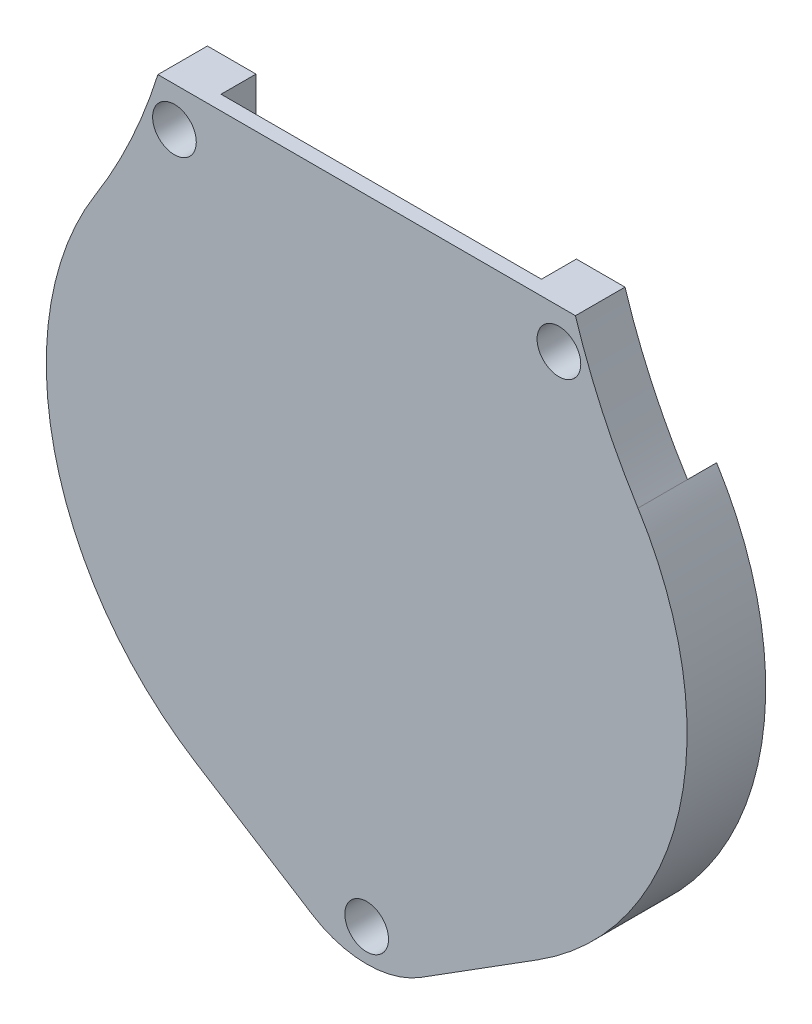
ISO-10303-21;
HEADER;
FILE_DESCRIPTION(('STEP AP214'),'2;1');
FILE_NAME('part.step','',(''),(''),'','','');
FILE_SCHEMA(('AUTOMOTIVE_DESIGN { 1 0 10303 214 1 1 1 1 }'));
ENDSEC;
DATA;
#1=APPLICATION_CONTEXT('core data for automotive mechanical design processes');
#2=APPLICATION_PROTOCOL_DEFINITION('international standard','automotive_design',2000,#1);
#3=PRODUCT_CONTEXT('',#1,'mechanical');
#4=PRODUCT('Part','Part','',(#3));
#5=PRODUCT_RELATED_PRODUCT_CATEGORY('part','',(#4));
#6=PRODUCT_DEFINITION_FORMATION('','',#4);
#7=PRODUCT_DEFINITION_CONTEXT('part definition',#1,'design');
#8=PRODUCT_DEFINITION('design','',#6,#7);
#9=PRODUCT_DEFINITION_SHAPE('','',#8);
#10=(LENGTH_UNIT() NAMED_UNIT(*) SI_UNIT(.MILLI.,.METRE.));
#11=(NAMED_UNIT(*) PLANE_ANGLE_UNIT() SI_UNIT($,.RADIAN.));
#12=(NAMED_UNIT(*) SI_UNIT($,.STERADIAN.) SOLID_ANGLE_UNIT());
#13=UNCERTAINTY_MEASURE_WITH_UNIT(LENGTH_MEASURE(1.E-05),#10,'distance_accuracy_value','');
#14=(GEOMETRIC_REPRESENTATION_CONTEXT(3) GLOBAL_UNCERTAINTY_ASSIGNED_CONTEXT((#13)) GLOBAL_UNIT_ASSIGNED_CONTEXT((#10,
#11,#12)) REPRESENTATION_CONTEXT('',''));
#15=CARTESIAN_POINT('',(0.,0.,0.));
#16=DIRECTION('',(0.,0.,1.));
#17=DIRECTION('',(1.,0.,0.));
#18=AXIS2_PLACEMENT_3D('',#15,#16,#17);
#19=CARTESIAN_POINT('',(0.,-22.5136363636364,0.));
#20=DIRECTION('',(0.,0.,-1.));
#21=DIRECTION('',(-1.,0.,0.));
#22=AXIS2_PLACEMENT_3D('',#19,#20,#21);
#23=PLANE('',#22);
#24=DIRECTION('',(-0.388341695242071,0.921515451707954,0.));
#25=VECTOR('',#24,1.);
#26=CARTESIAN_POINT('',(-23.6588709677419,14.8627529257449,0.));
#27=LINE('',#26,#25);
#28=CARTESIAN_POINT('',(-4.73782513208845,-30.035944055944,0.));
#29=VERTEX_POINT('',#28);
#30=CARTESIAN_POINT('',(-6.80534009565298,-25.1298342848197,0.));
#31=VERTEX_POINT('',#30);
#32=EDGE_CURVE('E189',#29,#31,#27,.T.);
#33=ORIENTED_EDGE('',*,*,#32,.F.);
#34=DIRECTION('',(0.846153846153846,-0.532938710021193,0.));
#35=VECTOR('',#34,1.);
#36=CARTESIAN_POINT('',(-4.73782513208844,-30.035944055944,0.));
#37=LINE('',#36,#35);
#38=CARTESIAN_POINT('',(-14.8903075579921,-23.6415384615385,0.));
#39=VERTEX_POINT('',#38);
#40=EDGE_CURVE('E340',#39,#29,#37,.T.);
#41=ORIENTED_EDGE('',*,*,#40,.F.);
#42=CARTESIAN_POINT('',(0.,0.,0.));
#43=DIRECTION('',(0.,0.,1.));
#44=DIRECTION('',(1.,0.,0.));
#45=AXIS2_PLACEMENT_3D('',#42,#43,#44);
#46=CIRCLE('',#45,27.94);
#47=CARTESIAN_POINT('',(-23.6588709677419,14.8627529257449,0.));
#48=VERTEX_POINT('',#47);
#49=EDGE_CURVE('E356',#48,#39,#46,.T.);
#50=ORIENTED_EDGE('',*,*,#49,.F.);
#51=CARTESIAN_POINT('',(-22.7387926966757,12.6794531308574,0.));
#52=VERTEX_POINT('',#51);
#53=EDGE_CURVE('E253',#52,#48,#27,.T.);
#54=ORIENTED_EDGE('',*,*,#53,.F.);
#55=CARTESIAN_POINT('',(0.,0.,0.));
#56=DIRECTION('',(0.,0.,-1.));
#57=DIRECTION('',(-1.,0.,0.));
#58=AXIS2_PLACEMENT_3D('',#55,#56,#57);
#59=CIRCLE('',#58,26.035);
#60=EDGE_CURVE('E321',#31,#52,#59,.T.);
#61=ORIENTED_EDGE('',*,*,#60,.F.);
#62=EDGE_LOOP('',(#33,#41,#50,#54,#61));
#63=FACE_BOUND('',#62,.T.);
#64=ADVANCED_FACE('F33',(#63),#23,.T.);
#65=CARTESIAN_POINT('',(11.7335904138503,23.241,6.35));
#66=DIRECTION('',(0.,1.,0.));
#67=DIRECTION('',(0.,0.,1.));
#68=AXIS2_PLACEMENT_3D('',#65,#66,#67);
#69=PLANE('',#68);
#70=DIRECTION('',(-1.,0.,0.));
#71=VECTOR('',#70,1.);
#72=CARTESIAN_POINT('',(11.7335904138503,23.241,5.588));
#73=LINE('',#72,#71);
#74=CARTESIAN_POINT('',(11.7335904138503,23.241,5.588));
#75=VERTEX_POINT('',#74);
#76=CARTESIAN_POINT('',(-11.7335904138503,23.241,5.588));
#77=VERTEX_POINT('',#76);
#78=EDGE_CURVE('E217',#75,#77,#73,.T.);
#79=ORIENTED_EDGE('',*,*,#78,.F.);
#80=DIRECTION('',(0.,0.,-1.));
#81=VECTOR('',#80,1.);
#82=CARTESIAN_POINT('',(11.7335904138503,23.241,6.35));
#83=LINE('',#82,#81);
#84=CARTESIAN_POINT('',(11.7335904138503,23.241,6.35));
#85=VERTEX_POINT('',#84);
#86=EDGE_CURVE('E331',#85,#75,#83,.T.);
#87=ORIENTED_EDGE('',*,*,#86,.F.);
#88=DIRECTION('',(1.,0.,0.));
#89=VECTOR('',#88,1.);
#90=CARTESIAN_POINT('',(11.7335904138503,23.241,6.35));
#91=LINE('',#90,#89);
#92=CARTESIAN_POINT('',(-11.7335904138503,23.241,6.35));
#93=VERTEX_POINT('',#92);
#94=EDGE_CURVE('E325',#93,#85,#91,.T.);
#95=ORIENTED_EDGE('',*,*,#94,.F.);
#96=DIRECTION('',(0.,0.,-1.));
#97=VECTOR('',#96,1.);
#98=CARTESIAN_POINT('',(-11.7335904138503,23.241,6.35));
#99=LINE('',#98,#97);
#100=EDGE_CURVE('E328',#93,#77,#99,.T.);
#101=ORIENTED_EDGE('',*,*,#100,.T.);
#102=EDGE_LOOP('',(#79,#87,#95,#101));
#103=FACE_BOUND('',#102,.T.);
#104=ADVANCED_FACE('F418',(#103),#69,.F.);
#105=CARTESIAN_POINT('',(0.,-22.5136363636364,6.858));
#106=DIRECTION('',(0.,0.,-1.));
#107=DIRECTION('',(-1.,0.,0.));
#108=AXIS2_PLACEMENT_3D('',#105,#106,#107);
#109=CYLINDRICAL_SURFACE('',#108,8.89);
#110=DIRECTION('',(0.,0.,-1.));
#111=VECTOR('',#110,1.);
#112=CARTESIAN_POINT('',(-4.73782513208844,-30.035944055944,6.858));
#113=LINE('',#112,#111);
#114=CARTESIAN_POINT('',(-4.73782513208844,-30.035944055944,6.858));
#115=VERTEX_POINT('',#114);
#116=CARTESIAN_POINT('',(-4.73782513208845,-30.035944055944,2.54));
#117=VERTEX_POINT('',#116);
#118=EDGE_CURVE('E353',#115,#117,#113,.T.);
#119=ORIENTED_EDGE('',*,*,#118,.T.);
#120=CARTESIAN_POINT('',(0.,-22.5136363636364,2.54));
#121=DIRECTION('',(0.,0.,-1.));
#122=DIRECTION('',(1.,0.,0.));
#123=AXIS2_PLACEMENT_3D('',#120,#121,#122);
#124=CIRCLE('',#123,8.89);
#125=CARTESIAN_POINT('',(4.73782513208845,-30.035944055944,2.54));
#126=VERTEX_POINT('',#125);
#127=EDGE_CURVE('E177',#126,#117,#124,.T.);
#128=ORIENTED_EDGE('',*,*,#127,.F.);
#129=DIRECTION('',(0.,0.,-1.));
#130=VECTOR('',#129,1.);
#131=CARTESIAN_POINT('',(4.73782513208844,-30.035944055944,6.858));
#132=LINE('',#131,#130);
#133=CARTESIAN_POINT('',(4.73782513208844,-30.035944055944,6.858));
#134=VERTEX_POINT('',#133);
#135=EDGE_CURVE('E209',#134,#126,#132,.T.);
#136=ORIENTED_EDGE('',*,*,#135,.F.);
#137=CARTESIAN_POINT('',(0.,-22.5136363636364,6.858));
#138=DIRECTION('',(0.,0.,1.));
#139=DIRECTION('',(-1.,0.,0.));
#140=AXIS2_PLACEMENT_3D('',#137,#138,#139);
#141=CIRCLE('',#140,8.89);
#142=EDGE_CURVE('E336',#115,#134,#141,.T.);
#143=ORIENTED_EDGE('',*,*,#142,.F.);
#144=EDGE_LOOP('',(#119,#128,#136,#143));
#145=FACE_BOUND('',#144,.T.);
#146=ADVANCED_FACE('F35',(#145),#109,.T.);
#147=CARTESIAN_POINT('',(4.73782513208844,-30.035944055944,6.858));
#148=DIRECTION('',(-0.532938710021193,0.846153846153846,0.));
#149=DIRECTION('',(-0.846153846153846,-0.532938710021193,0.));
#150=AXIS2_PLACEMENT_3D('',#147,#148,#149);
#151=PLANE('',#150);
#152=DIRECTION('',(0.846153846153846,0.532938710021193,0.));
#153=VECTOR('',#152,1.);
#154=CARTESIAN_POINT('',(4.73782513208844,-30.035944055944,0.));
#155=LINE('',#154,#153);
#156=CARTESIAN_POINT('',(4.73782513208845,-30.035944055944,0.));
#157=VERTEX_POINT('',#156);
#158=CARTESIAN_POINT('',(14.8903075579921,-23.6415384615385,0.));
#159=VERTEX_POINT('',#158);
#160=EDGE_CURVE('E250',#157,#159,#155,.T.);
#161=ORIENTED_EDGE('',*,*,#160,.T.);
#162=DIRECTION('',(0.,0.,-1.));
#163=VECTOR('',#162,1.);
#164=CARTESIAN_POINT('',(14.8903075579921,-23.6415384615385,6.858));
#165=LINE('',#164,#163);
#166=CARTESIAN_POINT('',(14.8903075579921,-23.6415384615385,6.858));
#167=VERTEX_POINT('',#166);
#168=EDGE_CURVE('E206',#167,#159,#165,.T.);
#169=ORIENTED_EDGE('',*,*,#168,.F.);
#170=DIRECTION('',(0.846153846153846,0.532938710021193,0.));
#171=VECTOR('',#170,1.);
#172=CARTESIAN_POINT('',(4.73782513208844,-30.035944055944,6.858));
#173=LINE('',#172,#171);
#174=EDGE_CURVE('E339',#134,#167,#173,.T.);
#175=ORIENTED_EDGE('',*,*,#174,.F.);
#176=ORIENTED_EDGE('',*,*,#135,.T.);
#177=DIRECTION('',(0.,0.,-1.));
#178=VECTOR('',#177,1.);
#179=CARTESIAN_POINT('',(4.73782513208845,-30.035944055944,2.54));
#180=LINE('',#179,#178);
#181=EDGE_CURVE('E201',#126,#157,#180,.T.);
#182=ORIENTED_EDGE('',*,*,#181,.T.);
#183=EDGE_LOOP('',(#161,#169,#175,#176,#182));
#184=FACE_BOUND('',#183,.T.);
#185=ADVANCED_FACE('F632',(#184),#151,.F.);
#186=CARTESIAN_POINT('',(0.,0.,6.858));
#187=DIRECTION('',(0.,0.,-1.));
#188=DIRECTION('',(-1.,0.,0.));
#189=AXIS2_PLACEMENT_3D('',#186,#187,#188);
#190=CYLINDRICAL_SURFACE('',#189,27.94);
#191=CARTESIAN_POINT('',(0.,0.,0.));
#192=DIRECTION('',(0.,0.,1.));
#193=DIRECTION('',(-1.,0.,0.));
#194=AXIS2_PLACEMENT_3D('',#191,#192,#193);
#195=CIRCLE('',#194,27.94);
#196=CARTESIAN_POINT('',(23.6588709677419,14.8627529257449,0.));
#197=VERTEX_POINT('',#196);
#198=EDGE_CURVE('E200',#159,#197,#195,.T.);
#199=ORIENTED_EDGE('',*,*,#198,.T.);
#200=DIRECTION('',(0.,0.,-1.));
#201=VECTOR('',#200,1.);
#202=CARTESIAN_POINT('',(23.6588709677419,14.8627529257449,2.54));
#203=LINE('',#202,#201);
#204=CARTESIAN_POINT('',(23.6588709677419,14.8627529257449,2.54));
#205=VERTEX_POINT('',#204);
#206=EDGE_CURVE('E173',#205,#197,#203,.T.);
#207=ORIENTED_EDGE('',*,*,#206,.F.);
#208=DIRECTION('',(0.,0.,-1.));
#209=VECTOR('',#208,1.);
#210=CARTESIAN_POINT('',(23.6588709677419,14.8627529257449,6.858));
#211=LINE('',#210,#209);
#212=CARTESIAN_POINT('',(23.6588709677419,14.8627529257449,6.858));
#213=VERTEX_POINT('',#212);
#214=EDGE_CURVE('E196',#213,#205,#211,.T.);
#215=ORIENTED_EDGE('',*,*,#214,.F.);
#216=CARTESIAN_POINT('',(0.,0.,6.858));
#217=DIRECTION('',(0.,0.,1.));
#218=DIRECTION('',(-1.,0.,0.));
#219=AXIS2_PLACEMENT_3D('',#216,#217,#218);
#220=CIRCLE('',#219,27.94);
#221=EDGE_CURVE('E342',#167,#213,#220,.T.);
#222=ORIENTED_EDGE('',*,*,#221,.F.);
#223=ORIENTED_EDGE('',*,*,#168,.T.);
#224=EDGE_LOOP('',(#199,#207,#215,#222,#223));
#225=FACE_BOUND('',#224,.T.);
#226=ADVANCED_FACE('F194',(#225),#190,.T.);
#227=CARTESIAN_POINT('',(66.675,41.8859400634629,6.858));
#228=DIRECTION('',(0.,0.,-1.));
#229=DIRECTION('',(-1.,0.,0.));
#230=AXIS2_PLACEMENT_3D('',#227,#228,#229);
#231=CYLINDRICAL_SURFACE('',#230,50.8);
#232=ORIENTED_EDGE('',*,*,#214,.T.);
#233=CARTESIAN_POINT('',(66.675,41.8859400634628,2.54));
#234=DIRECTION('',(0.,0.,1.));
#235=DIRECTION('',(1.,0.,0.));
#236=AXIS2_PLACEMENT_3D('',#233,#234,#235);
#237=CIRCLE('',#236,50.8);
#238=CARTESIAN_POINT('',(18.2073286304664,26.67,2.54));
#239=VERTEX_POINT('',#238);
#240=EDGE_CURVE('E181',#239,#205,#237,.T.);
#241=ORIENTED_EDGE('',*,*,#240,.F.);
#242=DIRECTION('',(0.,0.,-1.));
#243=VECTOR('',#242,1.);
#244=CARTESIAN_POINT('',(18.2073286304664,26.67,6.858));
#245=LINE('',#244,#243);
#246=CARTESIAN_POINT('',(18.2073286304664,26.67,6.858));
#247=VERTEX_POINT('',#246);
#248=EDGE_CURVE('E207',#247,#239,#245,.T.);
#249=ORIENTED_EDGE('',*,*,#248,.F.);
#250=CARTESIAN_POINT('',(66.675,41.8859400634629,6.858));
#251=DIRECTION('',(0.,0.,-1.));
#252=DIRECTION('',(1.,0.,0.));
#253=AXIS2_PLACEMENT_3D('',#250,#251,#252);
#254=CIRCLE('',#253,50.8);
#255=EDGE_CURVE('E205',#213,#247,#254,.T.);
#256=ORIENTED_EDGE('',*,*,#255,.F.);
#257=EDGE_LOOP('',(#232,#241,#249,#256));
#258=FACE_BOUND('',#257,.T.);
#259=ADVANCED_FACE('F204',(#258),#231,.F.);
#260=CARTESIAN_POINT('',(-18.2073286304664,26.67,6.858));
#261=DIRECTION('',(0.,-1.,0.));
#262=DIRECTION('',(0.,0.,-1.));
#263=AXIS2_PLACEMENT_3D('',#260,#261,#262);
#264=PLANE('',#263);
#265=ORIENTED_EDGE('',*,*,#248,.T.);
#266=DIRECTION('',(1.,0.,0.));
#267=VECTOR('',#266,1.);
#268=CARTESIAN_POINT('',(18.2073286304664,26.67,2.54));
#269=LINE('',#268,#267);
#270=CARTESIAN_POINT('',(13.97,26.67,2.54));
#271=VERTEX_POINT('',#270);
#272=EDGE_CURVE('E184',#271,#239,#269,.T.);
#273=ORIENTED_EDGE('',*,*,#272,.F.);
#274=DIRECTION('',(0.,0.,1.));
#275=VECTOR('',#274,1.);
#276=CARTESIAN_POINT('',(13.97,26.67,6.858));
#277=LINE('',#276,#275);
#278=CARTESIAN_POINT('',(13.97,26.67,5.588));
#279=VERTEX_POINT('',#278);
#280=EDGE_CURVE('E319',#271,#279,#277,.T.);
#281=ORIENTED_EDGE('',*,*,#280,.T.);
#282=DIRECTION('',(1.,0.,0.));
#283=VECTOR('',#282,1.);
#284=CARTESIAN_POINT('',(-18.2073286304664,26.67,5.588));
#285=LINE('',#284,#283);
#286=CARTESIAN_POINT('',(-13.97,26.67,5.588));
#287=VERTEX_POINT('',#286);
#288=EDGE_CURVE('E313',#287,#279,#285,.T.);
#289=ORIENTED_EDGE('',*,*,#288,.F.);
#290=DIRECTION('',(0.,0.,-1.));
#291=VECTOR('',#290,1.);
#292=CARTESIAN_POINT('',(-13.97,26.67,6.858));
#293=LINE('',#292,#291);
#294=CARTESIAN_POINT('',(-13.97,26.67,2.54));
#295=VERTEX_POINT('',#294);
#296=EDGE_CURVE('E316',#287,#295,#293,.T.);
#297=ORIENTED_EDGE('',*,*,#296,.T.);
#298=CARTESIAN_POINT('',(-18.2073286304664,26.67,2.54));
#299=VERTEX_POINT('',#298);
#300=EDGE_CURVE('E202',#299,#295,#269,.T.);
#301=ORIENTED_EDGE('',*,*,#300,.F.);
#302=DIRECTION('',(0.,0.,-1.));
#303=VECTOR('',#302,1.);
#304=CARTESIAN_POINT('',(-18.2073286304664,26.67,6.858));
#305=LINE('',#304,#303);
#306=CARTESIAN_POINT('',(-18.2073286304664,26.67,6.858));
#307=VERTEX_POINT('',#306);
#308=EDGE_CURVE('E211',#307,#299,#305,.T.);
#309=ORIENTED_EDGE('',*,*,#308,.F.);
#310=DIRECTION('',(-1.,0.,0.));
#311=VECTOR('',#310,1.);
#312=CARTESIAN_POINT('',(-18.2073286304664,26.67,6.858));
#313=LINE('',#312,#311);
#314=EDGE_CURVE('E345',#247,#307,#313,.T.);
#315=ORIENTED_EDGE('',*,*,#314,.F.);
#316=EDGE_LOOP('',(#265,#273,#281,#289,#297,#301,#309,#315));
#317=FACE_BOUND('',#316,.T.);
#318=ADVANCED_FACE('F378',(#317),#264,.F.);
#319=CARTESIAN_POINT('',(-66.675,41.8859400634629,6.858));
#320=DIRECTION('',(0.,0.,-1.));
#321=DIRECTION('',(-1.,0.,0.));
#322=AXIS2_PLACEMENT_3D('',#319,#320,#321);
#323=CYLINDRICAL_SURFACE('',#322,50.8);
#324=ORIENTED_EDGE('',*,*,#308,.T.);
#325=CARTESIAN_POINT('',(-66.675,41.8859400634628,2.54));
#326=DIRECTION('',(0.,0.,1.));
#327=DIRECTION('',(-1.,0.,0.));
#328=AXIS2_PLACEMENT_3D('',#325,#326,#327);
#329=CIRCLE('',#328,50.8);
#330=CARTESIAN_POINT('',(-23.6588709677419,14.8627529257449,2.54));
#331=VERTEX_POINT('',#330);
#332=EDGE_CURVE('E374',#331,#299,#329,.T.);
#333=ORIENTED_EDGE('',*,*,#332,.F.);
#334=DIRECTION('',(0.,0.,-1.));
#335=VECTOR('',#334,1.);
#336=CARTESIAN_POINT('',(-23.6588709677419,14.8627529257449,6.858));
#337=LINE('',#336,#335);
#338=CARTESIAN_POINT('',(-23.6588709677419,14.8627529257449,6.858));
#339=VERTEX_POINT('',#338);
#340=EDGE_CURVE('E365',#339,#331,#337,.T.);
#341=ORIENTED_EDGE('',*,*,#340,.F.);
#342=CARTESIAN_POINT('',(-66.675,41.8859400634629,6.858));
#343=DIRECTION('',(0.,0.,-1.));
#344=DIRECTION('',(-1.,0.,0.));
#345=AXIS2_PLACEMENT_3D('',#342,#343,#344);
#346=CIRCLE('',#345,50.8);
#347=EDGE_CURVE('E347',#307,#339,#346,.T.);
#348=ORIENTED_EDGE('',*,*,#347,.F.);
#349=EDGE_LOOP('',(#324,#333,#341,#348));
#350=FACE_BOUND('',#349,.T.);
#351=ADVANCED_FACE('F372',(#350),#323,.F.);
#352=CARTESIAN_POINT('',(0.,0.,6.858));
#353=DIRECTION('',(0.,0.,-1.));
#354=DIRECTION('',(-1.,0.,0.));
#355=AXIS2_PLACEMENT_3D('',#352,#353,#354);
#356=CYLINDRICAL_SURFACE('',#355,27.94);
#357=ORIENTED_EDGE('',*,*,#49,.T.);
#358=DIRECTION('',(0.,0.,-1.));
#359=VECTOR('',#358,1.);
#360=CARTESIAN_POINT('',(-14.8903075579921,-23.6415384615385,6.858));
#361=LINE('',#360,#359);
#362=CARTESIAN_POINT('',(-14.8903075579921,-23.6415384615385,6.858));
#363=VERTEX_POINT('',#362);
#364=EDGE_CURVE('E362',#363,#39,#361,.T.);
#365=ORIENTED_EDGE('',*,*,#364,.F.);
#366=CARTESIAN_POINT('',(0.,0.,6.858));
#367=DIRECTION('',(0.,0.,1.));
#368=DIRECTION('',(1.,0.,0.));
#369=AXIS2_PLACEMENT_3D('',#366,#367,#368);
#370=CIRCLE('',#369,27.94);
#371=EDGE_CURVE('E349',#339,#363,#370,.T.);
#372=ORIENTED_EDGE('',*,*,#371,.F.);
#373=ORIENTED_EDGE('',*,*,#340,.T.);
#374=DIRECTION('',(0.,0.,-1.));
#375=VECTOR('',#374,1.);
#376=CARTESIAN_POINT('',(-23.6588709677419,14.8627529257449,2.54));
#377=LINE('',#376,#375);
#378=EDGE_CURVE('E228',#331,#48,#377,.T.);
#379=ORIENTED_EDGE('',*,*,#378,.T.);
#380=EDGE_LOOP('',(#357,#365,#372,#373,#379));
#381=FACE_BOUND('',#380,.T.);
#382=ADVANCED_FACE('F394',(#381),#356,.T.);
#383=CARTESIAN_POINT('',(-4.73782513208844,-30.035944055944,6.858));
#384=DIRECTION('',(0.532938710021193,0.846153846153846,0.));
#385=DIRECTION('',(-0.846153846153846,0.532938710021193,0.));
#386=AXIS2_PLACEMENT_3D('',#383,#384,#385);
#387=PLANE('',#386);
#388=ORIENTED_EDGE('',*,*,#40,.T.);
#389=DIRECTION('',(0.,0.,-1.));
#390=VECTOR('',#389,1.);
#391=CARTESIAN_POINT('',(-4.73782513208845,-30.035944055944,2.54));
#392=LINE('',#391,#390);
#393=EDGE_CURVE('E260',#117,#29,#392,.T.);
#394=ORIENTED_EDGE('',*,*,#393,.F.);
#395=ORIENTED_EDGE('',*,*,#118,.F.);
#396=DIRECTION('',(0.846153846153846,-0.532938710021193,0.));
#397=VECTOR('',#396,1.);
#398=CARTESIAN_POINT('',(-4.73782513208844,-30.035944055944,6.858));
#399=LINE('',#398,#397);
#400=EDGE_CURVE('E351',#363,#115,#399,.T.);
#401=ORIENTED_EDGE('',*,*,#400,.F.);
#402=ORIENTED_EDGE('',*,*,#364,.T.);
#403=EDGE_LOOP('',(#388,#394,#395,#401,#402));
#404=FACE_BOUND('',#403,.T.);
#405=ADVANCED_FACE('F402',(#404),#387,.F.);
#406=CARTESIAN_POINT('',(0.,-22.5136363636364,6.858));
#407=DIRECTION('',(0.,0.,-1.));
#408=DIRECTION('',(-1.,0.,0.));
#409=AXIS2_PLACEMENT_3D('',#406,#407,#408);
#410=PLANE('',#409);
#411=CARTESIAN_POINT('',(0.,-28.575,6.858));
#412=DIRECTION('',(0.,0.,1.));
#413=DIRECTION('',(1.,0.,0.));
#414=AXIS2_PLACEMENT_3D('',#411,#412,#413);
#415=CIRCLE('',#414,1.905);
#416=CARTESIAN_POINT('',(1.905,-28.575,6.858));
#417=VERTEX_POINT('',#416);
#418=EDGE_CURVE('E290',#417,#417,#415,.T.);
#419=ORIENTED_EDGE('',*,*,#418,.F.);
#420=EDGE_LOOP('',(#419));
#421=FACE_BOUND('',#420,.T.);
#422=CARTESIAN_POINT('',(-16.764,23.241,6.858));
#423=DIRECTION('',(0.,0.,1.));
#424=DIRECTION('',(1.,0.,0.));
#425=AXIS2_PLACEMENT_3D('',#422,#423,#424);
#426=CIRCLE('',#425,1.905);
#427=CARTESIAN_POINT('',(-14.859,23.241,6.858));
#428=VERTEX_POINT('',#427);
#429=EDGE_CURVE('E296',#428,#428,#426,.T.);
#430=ORIENTED_EDGE('',*,*,#429,.F.);
#431=EDGE_LOOP('',(#430));
#432=FACE_BOUND('',#431,.T.);
#433=CARTESIAN_POINT('',(16.764,23.241,6.858));
#434=DIRECTION('',(0.,0.,1.));
#435=DIRECTION('',(1.,0.,0.));
#436=AXIS2_PLACEMENT_3D('',#433,#434,#435);
#437=CIRCLE('',#436,1.905);
#438=CARTESIAN_POINT('',(18.669,23.241,6.858));
#439=VERTEX_POINT('',#438);
#440=EDGE_CURVE('E279',#439,#439,#437,.T.);
#441=ORIENTED_EDGE('',*,*,#440,.F.);
#442=EDGE_LOOP('',(#441));
#443=FACE_BOUND('',#442,.T.);
#444=ORIENTED_EDGE('',*,*,#142,.T.);
#445=ORIENTED_EDGE('',*,*,#174,.T.);
#446=ORIENTED_EDGE('',*,*,#221,.T.);
#447=ORIENTED_EDGE('',*,*,#255,.T.);
#448=ORIENTED_EDGE('',*,*,#314,.T.);
#449=ORIENTED_EDGE('',*,*,#347,.T.);
#450=ORIENTED_EDGE('',*,*,#371,.T.);
#451=ORIENTED_EDGE('',*,*,#400,.T.);
#452=EDGE_LOOP('',(#444,#445,#446,#447,#448,#449,#450,#451));
#453=FACE_BOUND('',#452,.T.);
#454=ADVANCED_FACE('F406',(#421,#432,#443,#453),#410,.F.);
#455=DIRECTION('',(-0.388341695242071,-0.921515451707954,0.));
#456=VECTOR('',#455,1.);
#457=CARTESIAN_POINT('',(23.6588709677419,14.8627529257449,0.));
#458=LINE('',#457,#456);
#459=CARTESIAN_POINT('',(22.7387926966757,12.6794531308574,0.));
#460=VERTEX_POINT('',#459);
#461=EDGE_CURVE('E251',#197,#460,#458,.T.);
#462=ORIENTED_EDGE('',*,*,#461,.F.);
#463=ORIENTED_EDGE('',*,*,#198,.F.);
#464=ORIENTED_EDGE('',*,*,#160,.F.);
#465=CARTESIAN_POINT('',(6.80534009565298,-25.1298342848197,0.));
#466=VERTEX_POINT('',#465);
#467=EDGE_CURVE('E245',#466,#157,#458,.T.);
#468=ORIENTED_EDGE('',*,*,#467,.F.);
#469=EDGE_CURVE('E239',#460,#466,#59,.T.);
#470=ORIENTED_EDGE('',*,*,#469,.F.);
#471=EDGE_LOOP('',(#462,#463,#464,#468,#470));
#472=FACE_BOUND('',#471,.T.);
#473=ADVANCED_FACE('F249',(#472),#23,.T.);
#474=CARTESIAN_POINT('',(0.,0.,6.35));
#475=DIRECTION('',(0.,0.,-1.));
#476=DIRECTION('',(-1.,0.,0.));
#477=AXIS2_PLACEMENT_3D('',#474,#475,#476);
#478=CYLINDRICAL_SURFACE('',#477,26.035);
#479=CARTESIAN_POINT('',(0.,0.,2.54));
#480=DIRECTION('',(0.,0.,1.));
#481=DIRECTION('',(1.,0.,0.));
#482=AXIS2_PLACEMENT_3D('',#479,#480,#481);
#483=CIRCLE('',#482,26.035);
#484=CARTESIAN_POINT('',(6.80534009565298,-25.1298342848197,2.54));
#485=VERTEX_POINT('',#484);
#486=CARTESIAN_POINT('',(-6.80534009565298,-25.1298342848197,2.54));
#487=VERTEX_POINT('',#486);
#488=EDGE_CURVE('E237',#485,#487,#483,.F.);
#489=ORIENTED_EDGE('',*,*,#488,.T.);
#490=DIRECTION('',(0.,0.,-1.));
#491=VECTOR('',#490,1.);
#492=CARTESIAN_POINT('',(-6.80534009565298,-25.1298342848197,6.35));
#493=LINE('',#492,#491);
#494=EDGE_CURVE('E11',#487,#31,#493,.T.);
#495=ORIENTED_EDGE('',*,*,#494,.T.);
#496=ORIENTED_EDGE('',*,*,#60,.T.);
#497=DIRECTION('',(0.,0.,-1.));
#498=VECTOR('',#497,1.);
#499=CARTESIAN_POINT('',(-22.7387926966757,12.6794531308574,6.35));
#500=LINE('',#499,#498);
#501=CARTESIAN_POINT('',(-22.7387926966757,12.6794531308574,2.54));
#502=VERTEX_POINT('',#501);
#503=EDGE_CURVE('E230',#52,#502,#500,.F.);
#504=ORIENTED_EDGE('',*,*,#503,.T.);
#505=CARTESIAN_POINT('',(-13.97,21.9695317428479,2.54));
#506=VERTEX_POINT('',#505);
#507=EDGE_CURVE('E271',#502,#506,#483,.F.);
#508=ORIENTED_EDGE('',*,*,#507,.T.);
#509=DIRECTION('',(0.,0.,-1.));
#510=VECTOR('',#509,1.);
#511=CARTESIAN_POINT('',(-13.97,21.9695317428479,6.35));
#512=LINE('',#511,#510);
#513=CARTESIAN_POINT('',(-13.97,21.9695317428479,5.588));
#514=VERTEX_POINT('',#513);
#515=EDGE_CURVE('E219',#506,#514,#512,.F.);
#516=ORIENTED_EDGE('',*,*,#515,.T.);
#517=CARTESIAN_POINT('',(0.,0.,5.588));
#518=DIRECTION('',(0.,0.,-1.));
#519=DIRECTION('',(-1.,0.,0.));
#520=AXIS2_PLACEMENT_3D('',#517,#518,#519);
#521=CIRCLE('',#520,26.035);
#522=EDGE_CURVE('E309',#77,#514,#521,.F.);
#523=ORIENTED_EDGE('',*,*,#522,.F.);
#524=ORIENTED_EDGE('',*,*,#100,.F.);
#525=CARTESIAN_POINT('',(0.,0.,6.35));
#526=DIRECTION('',(0.,0.,-1.));
#527=DIRECTION('',(-1.,0.,0.));
#528=AXIS2_PLACEMENT_3D('',#525,#526,#527);
#529=CIRCLE('',#528,26.035);
#530=EDGE_CURVE('E322',#85,#93,#529,.T.);
#531=ORIENTED_EDGE('',*,*,#530,.F.);
#532=ORIENTED_EDGE('',*,*,#86,.T.);
#533=CARTESIAN_POINT('',(13.97,21.9695317428479,5.588));
#534=VERTEX_POINT('',#533);
#535=EDGE_CURVE('E312',#534,#75,#521,.F.);
#536=ORIENTED_EDGE('',*,*,#535,.F.);
#537=DIRECTION('',(0.,0.,-1.));
#538=VECTOR('',#537,1.);
#539=CARTESIAN_POINT('',(13.97,21.9695317428479,6.35));
#540=LINE('',#539,#538);
#541=CARTESIAN_POINT('',(13.97,21.9695317428479,2.54));
#542=VERTEX_POINT('',#541);
#543=EDGE_CURVE('E221',#534,#542,#540,.T.);
#544=ORIENTED_EDGE('',*,*,#543,.T.);
#545=CARTESIAN_POINT('',(22.7387926966757,12.6794531308574,2.54));
#546=VERTEX_POINT('',#545);
#547=EDGE_CURVE('E56',#542,#546,#483,.F.);
#548=ORIENTED_EDGE('',*,*,#547,.T.);
#549=DIRECTION('',(0.,0.,-1.));
#550=VECTOR('',#549,1.);
#551=CARTESIAN_POINT('',(22.7387926966757,12.6794531308574,6.35));
#552=LINE('',#551,#550);
#553=EDGE_CURVE('E176',#546,#460,#552,.T.);
#554=ORIENTED_EDGE('',*,*,#553,.T.);
#555=ORIENTED_EDGE('',*,*,#469,.T.);
#556=DIRECTION('',(0.,0.,-1.));
#557=VECTOR('',#556,1.);
#558=CARTESIAN_POINT('',(6.80534009565298,-25.1298342848197,6.35));
#559=LINE('',#558,#557);
#560=EDGE_CURVE('E41',#466,#485,#559,.F.);
#561=ORIENTED_EDGE('',*,*,#560,.T.);
#562=EDGE_LOOP('',(#489,#495,#496,#504,#508,#516,#523,#524,#531,#532,#536,#544,#548,#554,#555,#561));
#563=FACE_BOUND('',#562,.T.);
#564=ADVANCED_FACE('F236',(#563),#478,.F.);
#565=CARTESIAN_POINT('',(0.,0.,6.35));
#566=DIRECTION('',(0.,0.,-1.));
#567=DIRECTION('',(-1.,0.,0.));
#568=AXIS2_PLACEMENT_3D('',#565,#566,#567);
#569=PLANE('',#568);
#570=ORIENTED_EDGE('',*,*,#530,.T.);
#571=ORIENTED_EDGE('',*,*,#94,.T.);
#572=EDGE_LOOP('',(#570,#571));
#573=FACE_BOUND('',#572,.T.);
#574=ADVANCED_FACE('F432',(#573),#569,.T.);
#575=CARTESIAN_POINT('',(13.97,37.2037492414519,5.588));
#576=DIRECTION('',(1.,0.,0.));
#577=DIRECTION('',(0.,1.,0.));
#578=AXIS2_PLACEMENT_3D('',#575,#576,#577);
#579=PLANE('',#578);
#580=ORIENTED_EDGE('',*,*,#280,.F.);
#581=DIRECTION('',(0.,-1.,0.));
#582=VECTOR('',#581,1.);
#583=CARTESIAN_POINT('',(13.97,37.2037492414519,2.54));
#584=LINE('',#583,#582);
#585=EDGE_CURVE('E274',#271,#542,#584,.T.);
#586=ORIENTED_EDGE('',*,*,#585,.T.);
#587=ORIENTED_EDGE('',*,*,#543,.F.);
#588=DIRECTION('',(0.,-1.,0.));
#589=VECTOR('',#588,1.);
#590=CARTESIAN_POINT('',(13.97,37.2037492414519,5.588));
#591=LINE('',#590,#589);
#592=EDGE_CURVE('E289',#279,#534,#591,.T.);
#593=ORIENTED_EDGE('',*,*,#592,.F.);
#594=EDGE_LOOP('',(#580,#586,#587,#593));
#595=FACE_BOUND('',#594,.T.);
#596=ADVANCED_FACE('F410',(#595),#579,.F.);
#597=CARTESIAN_POINT('',(-13.97,37.2037492414519,5.588));
#598=DIRECTION('',(-1.,0.,0.));
#599=DIRECTION('',(0.,-1.,0.));
#600=AXIS2_PLACEMENT_3D('',#597,#598,#599);
#601=PLANE('',#600);
#602=ORIENTED_EDGE('',*,*,#515,.F.);
#603=DIRECTION('',(0.,1.,0.));
#604=VECTOR('',#603,1.);
#605=CARTESIAN_POINT('',(-13.97,37.2037492414519,2.54));
#606=LINE('',#605,#604);
#607=EDGE_CURVE('E268',#506,#295,#606,.T.);
#608=ORIENTED_EDGE('',*,*,#607,.T.);
#609=ORIENTED_EDGE('',*,*,#296,.F.);
#610=DIRECTION('',(0.,1.,0.));
#611=VECTOR('',#610,1.);
#612=CARTESIAN_POINT('',(-13.97,37.2037492414519,5.588));
#613=LINE('',#612,#611);
#614=EDGE_CURVE('E306',#514,#287,#613,.T.);
#615=ORIENTED_EDGE('',*,*,#614,.F.);
#616=EDGE_LOOP('',(#602,#608,#609,#615));
#617=FACE_BOUND('',#616,.T.);
#618=ADVANCED_FACE('F423',(#617),#601,.F.);
#619=CARTESIAN_POINT('',(0.,0.,5.588));
#620=DIRECTION('',(0.,0.,-1.));
#621=DIRECTION('',(-1.,0.,0.));
#622=AXIS2_PLACEMENT_3D('',#619,#620,#621);
#623=PLANE('',#622);
#624=ORIENTED_EDGE('',*,*,#288,.T.);
#625=ORIENTED_EDGE('',*,*,#592,.T.);
#626=ORIENTED_EDGE('',*,*,#535,.T.);
#627=ORIENTED_EDGE('',*,*,#78,.T.);
#628=ORIENTED_EDGE('',*,*,#522,.T.);
#629=ORIENTED_EDGE('',*,*,#614,.T.);
#630=EDGE_LOOP('',(#624,#625,#626,#627,#628,#629));
#631=FACE_BOUND('',#630,.T.);
#632=ADVANCED_FACE('F413',(#631),#623,.T.);
#633=CARTESIAN_POINT('',(16.764,23.241,3.683));
#634=DIRECTION('',(0.,0.,1.));
#635=DIRECTION('',(1.,0.,0.));
#636=AXIS2_PLACEMENT_3D('',#633,#634,#635);
#637=CYLINDRICAL_SURFACE('',#636,1.905);
#638=CARTESIAN_POINT('',(16.764,23.241,3.683));
#639=DIRECTION('',(0.,0.,1.));
#640=DIRECTION('',(1.,0.,0.));
#641=AXIS2_PLACEMENT_3D('',#638,#639,#640);
#642=CIRCLE('',#641,1.905);
#643=CARTESIAN_POINT('',(18.669,23.241,3.683));
#644=VERTEX_POINT('',#643);
#645=EDGE_CURVE('E299',#644,#644,#642,.T.);
#646=ORIENTED_EDGE('',*,*,#645,.F.);
#647=EDGE_LOOP('',(#646));
#648=FACE_BOUND('',#647,.T.);
#649=ORIENTED_EDGE('',*,*,#440,.T.);
#650=EDGE_LOOP('',(#649));
#651=FACE_BOUND('',#650,.T.);
#652=ADVANCED_FACE('F430',(#648,#651),#637,.F.);
#653=CARTESIAN_POINT('',(16.764,23.241,3.683));
#654=DIRECTION('',(0.,0.,1.));
#655=DIRECTION('',(1.,0.,0.));
#656=AXIS2_PLACEMENT_3D('',#653,#654,#655);
#657=PLANE('',#656);
#658=CARTESIAN_POINT('',(16.764,23.241,3.683));
#659=DIRECTION('',(0.,0.,1.));
#660=DIRECTION('',(1.,0.,0.));
#661=AXIS2_PLACEMENT_3D('',#658,#659,#660);
#662=CIRCLE('',#661,1.143);
#663=CARTESIAN_POINT('',(17.907,23.241,3.683));
#664=VERTEX_POINT('',#663);
#665=EDGE_CURVE('E280',#664,#664,#662,.T.);
#666=ORIENTED_EDGE('',*,*,#665,.F.);
#667=EDGE_LOOP('',(#666));
#668=FACE_BOUND('',#667,.T.);
#669=ORIENTED_EDGE('',*,*,#645,.T.);
#670=EDGE_LOOP('',(#669));
#671=FACE_BOUND('',#670,.T.);
#672=ADVANCED_FACE('F585',(#668,#671),#657,.T.);
#673=CARTESIAN_POINT('',(-16.764,23.241,3.683));
#674=DIRECTION('',(0.,0.,1.));
#675=DIRECTION('',(1.,0.,0.));
#676=AXIS2_PLACEMENT_3D('',#673,#674,#675);
#677=CYLINDRICAL_SURFACE('',#676,1.905);
#678=CARTESIAN_POINT('',(-16.764,23.241,3.683));
#679=DIRECTION('',(0.,0.,1.));
#680=DIRECTION('',(1.,0.,0.));
#681=AXIS2_PLACEMENT_3D('',#678,#679,#680);
#682=CIRCLE('',#681,1.905);
#683=CARTESIAN_POINT('',(-14.859,23.241,3.683));
#684=VERTEX_POINT('',#683);
#685=EDGE_CURVE('E293',#684,#684,#682,.T.);
#686=ORIENTED_EDGE('',*,*,#685,.F.);
#687=EDGE_LOOP('',(#686));
#688=FACE_BOUND('',#687,.T.);
#689=ORIENTED_EDGE('',*,*,#429,.T.);
#690=EDGE_LOOP('',(#689));
#691=FACE_BOUND('',#690,.T.);
#692=ADVANCED_FACE('F581',(#688,#691),#677,.F.);
#693=CARTESIAN_POINT('',(-16.764,23.241,3.683));
#694=DIRECTION('',(0.,0.,1.));
#695=DIRECTION('',(1.,0.,0.));
#696=AXIS2_PLACEMENT_3D('',#693,#694,#695);
#697=PLANE('',#696);
#698=CARTESIAN_POINT('',(-16.764,23.241,3.683));
#699=DIRECTION('',(0.,0.,1.));
#700=DIRECTION('',(1.,0.,0.));
#701=AXIS2_PLACEMENT_3D('',#698,#699,#700);
#702=CIRCLE('',#701,1.143);
#703=CARTESIAN_POINT('',(-15.621,23.241,3.683));
#704=VERTEX_POINT('',#703);
#705=EDGE_CURVE('E276',#704,#704,#702,.T.);
#706=ORIENTED_EDGE('',*,*,#705,.F.);
#707=EDGE_LOOP('',(#706));
#708=FACE_BOUND('',#707,.T.);
#709=ORIENTED_EDGE('',*,*,#685,.T.);
#710=EDGE_LOOP('',(#709));
#711=FACE_BOUND('',#710,.T.);
#712=ADVANCED_FACE('F577',(#708,#711),#697,.T.);
#713=CARTESIAN_POINT('',(0.,-28.575,3.683));
#714=DIRECTION('',(0.,0.,1.));
#715=DIRECTION('',(1.,0.,0.));
#716=AXIS2_PLACEMENT_3D('',#713,#714,#715);
#717=CYLINDRICAL_SURFACE('',#716,1.905);
#718=CARTESIAN_POINT('',(0.,-28.575,3.683));
#719=DIRECTION('',(0.,0.,1.));
#720=DIRECTION('',(1.,0.,0.));
#721=AXIS2_PLACEMENT_3D('',#718,#719,#720);
#722=CIRCLE('',#721,1.905);
#723=CARTESIAN_POINT('',(1.905,-28.575,3.683));
#724=VERTEX_POINT('',#723);
#725=EDGE_CURVE('E286',#724,#724,#722,.T.);
#726=ORIENTED_EDGE('',*,*,#725,.F.);
#727=EDGE_LOOP('',(#726));
#728=FACE_BOUND('',#727,.T.);
#729=ORIENTED_EDGE('',*,*,#418,.T.);
#730=EDGE_LOOP('',(#729));
#731=FACE_BOUND('',#730,.T.);
#732=ADVANCED_FACE('F573',(#728,#731),#717,.F.);
#733=CARTESIAN_POINT('',(0.,-28.575,3.683));
#734=DIRECTION('',(0.,0.,1.));
#735=DIRECTION('',(1.,0.,0.));
#736=AXIS2_PLACEMENT_3D('',#733,#734,#735);
#737=PLANE('',#736);
#738=CARTESIAN_POINT('',(0.,-28.575,3.683));
#739=DIRECTION('',(0.,0.,1.));
#740=DIRECTION('',(1.,0.,0.));
#741=AXIS2_PLACEMENT_3D('',#738,#739,#740);
#742=CIRCLE('',#741,1.143);
#743=CARTESIAN_POINT('',(1.143,-28.575,3.683));
#744=VERTEX_POINT('',#743);
#745=EDGE_CURVE('E283',#744,#744,#742,.T.);
#746=ORIENTED_EDGE('',*,*,#745,.F.);
#747=EDGE_LOOP('',(#746));
#748=FACE_BOUND('',#747,.T.);
#749=ORIENTED_EDGE('',*,*,#725,.T.);
#750=EDGE_LOOP('',(#749));
#751=FACE_BOUND('',#750,.T.);
#752=ADVANCED_FACE('F485',(#748,#751),#737,.T.);
#753=CARTESIAN_POINT('',(0.,-28.575,-17.907));
#754=DIRECTION('',(0.,0.,1.));
#755=DIRECTION('',(1.,0.,0.));
#756=AXIS2_PLACEMENT_3D('',#753,#754,#755);
#757=CYLINDRICAL_SURFACE('',#756,1.143);
#758=CARTESIAN_POINT('',(0.,-28.575,2.54));
#759=DIRECTION('',(0.,0.,1.));
#760=DIRECTION('',(1.,0.,0.));
#761=AXIS2_PLACEMENT_3D('',#758,#759,#760);
#762=CIRCLE('',#761,1.143);
#763=CARTESIAN_POINT('',(1.143,-28.575,2.54));
#764=VERTEX_POINT('',#763);
#765=EDGE_CURVE('E265',#764,#764,#762,.F.);
#766=ORIENTED_EDGE('',*,*,#765,.T.);
#767=EDGE_LOOP('',(#766));
#768=FACE_BOUND('',#767,.T.);
#769=ORIENTED_EDGE('',*,*,#745,.T.);
#770=EDGE_LOOP('',(#769));
#771=FACE_BOUND('',#770,.T.);
#772=ADVANCED_FACE('F479',(#768,#771),#757,.F.);
#773=CARTESIAN_POINT('',(16.764,23.241,-17.907));
#774=DIRECTION('',(0.,0.,1.));
#775=DIRECTION('',(1.,0.,0.));
#776=AXIS2_PLACEMENT_3D('',#773,#774,#775);
#777=CYLINDRICAL_SURFACE('',#776,1.143);
#778=CARTESIAN_POINT('',(16.764,23.241,2.54));
#779=DIRECTION('',(0.,0.,1.));
#780=DIRECTION('',(1.,0.,0.));
#781=AXIS2_PLACEMENT_3D('',#778,#779,#780);
#782=CIRCLE('',#781,1.143);
#783=CARTESIAN_POINT('',(17.907,23.241,2.54));
#784=VERTEX_POINT('',#783);
#785=EDGE_CURVE('E227',#784,#784,#782,.F.);
#786=ORIENTED_EDGE('',*,*,#785,.T.);
#787=EDGE_LOOP('',(#786));
#788=FACE_BOUND('',#787,.T.);
#789=ORIENTED_EDGE('',*,*,#665,.T.);
#790=EDGE_LOOP('',(#789));
#791=FACE_BOUND('',#790,.T.);
#792=ADVANCED_FACE('F484',(#788,#791),#777,.F.);
#793=CARTESIAN_POINT('',(-16.764,23.241,-17.907));
#794=DIRECTION('',(0.,0.,1.));
#795=DIRECTION('',(1.,0.,0.));
#796=AXIS2_PLACEMENT_3D('',#793,#794,#795);
#797=CYLINDRICAL_SURFACE('',#796,1.143);
#798=CARTESIAN_POINT('',(-16.764,23.241,2.54));
#799=DIRECTION('',(0.,0.,1.));
#800=DIRECTION('',(1.,0.,0.));
#801=AXIS2_PLACEMENT_3D('',#798,#799,#800);
#802=CIRCLE('',#801,1.143);
#803=CARTESIAN_POINT('',(-15.621,23.241,2.54));
#804=VERTEX_POINT('',#803);
#805=EDGE_CURVE('E224',#804,#804,#802,.F.);
#806=ORIENTED_EDGE('',*,*,#805,.T.);
#807=EDGE_LOOP('',(#806));
#808=FACE_BOUND('',#807,.T.);
#809=ORIENTED_EDGE('',*,*,#705,.T.);
#810=EDGE_LOOP('',(#809));
#811=FACE_BOUND('',#810,.T.);
#812=ADVANCED_FACE('F497',(#808,#811),#797,.F.);
#813=CARTESIAN_POINT('',(66.675,41.8859400634628,2.54));
#814=DIRECTION('',(0.,0.,1.));
#815=DIRECTION('',(1.,0.,0.));
#816=AXIS2_PLACEMENT_3D('',#813,#814,#815);
#817=PLANE('',#816);
#818=ORIENTED_EDGE('',*,*,#805,.F.);
#819=EDGE_LOOP('',(#818));
#820=FACE_BOUND('',#819,.T.);
#821=DIRECTION('',(-0.388341695242071,0.921515451707954,0.));
#822=VECTOR('',#821,1.);
#823=CARTESIAN_POINT('',(-23.6588709677419,14.8627529257449,2.54));
#824=LINE('',#823,#822);
#825=EDGE_CURVE('E381',#502,#331,#824,.T.);
#826=ORIENTED_EDGE('',*,*,#825,.T.);
#827=ORIENTED_EDGE('',*,*,#332,.T.);
#828=ORIENTED_EDGE('',*,*,#300,.T.);
#829=ORIENTED_EDGE('',*,*,#607,.F.);
#830=ORIENTED_EDGE('',*,*,#507,.F.);
#831=EDGE_LOOP('',(#826,#827,#828,#829,#830));
#832=FACE_BOUND('',#831,.T.);
#833=ADVANCED_FACE('F388',(#820,#832),#817,.F.);
#834=CARTESIAN_POINT('',(-23.6588709677419,14.8627529257449,2.54));
#835=DIRECTION('',(-0.921515451707954,-0.388341695242071,0.));
#836=DIRECTION('',(0.388341695242071,-0.921515451707954,0.));
#837=AXIS2_PLACEMENT_3D('',#834,#835,#836);
#838=PLANE('',#837);
#839=ORIENTED_EDGE('',*,*,#53,.T.);
#840=ORIENTED_EDGE('',*,*,#378,.F.);
#841=ORIENTED_EDGE('',*,*,#825,.F.);
#842=ORIENTED_EDGE('',*,*,#503,.F.);
#843=EDGE_LOOP('',(#839,#840,#841,#842));
#844=FACE_BOUND('',#843,.T.);
#845=ADVANCED_FACE('F390',(#844),#838,.F.);
#846=ORIENTED_EDGE('',*,*,#785,.F.);
#847=EDGE_LOOP('',(#846));
#848=FACE_BOUND('',#847,.T.);
#849=ORIENTED_EDGE('',*,*,#585,.F.);
#850=ORIENTED_EDGE('',*,*,#272,.T.);
#851=ORIENTED_EDGE('',*,*,#240,.T.);
#852=DIRECTION('',(-0.388341695242071,-0.921515451707954,0.));
#853=VECTOR('',#852,1.);
#854=CARTESIAN_POINT('',(23.6588709677419,14.8627529257449,2.54));
#855=LINE('',#854,#853);
#856=EDGE_CURVE('E169',#205,#546,#855,.T.);
#857=ORIENTED_EDGE('',*,*,#856,.T.);
#858=ORIENTED_EDGE('',*,*,#547,.F.);
#859=EDGE_LOOP('',(#849,#850,#851,#857,#858));
#860=FACE_BOUND('',#859,.T.);
#861=ADVANCED_FACE('F182',(#848,#860),#817,.F.);
#862=CARTESIAN_POINT('',(23.6588709677419,14.8627529257449,2.54));
#863=DIRECTION('',(0.921515451707954,-0.388341695242071,0.));
#864=DIRECTION('',(0.388341695242071,0.921515451707954,0.));
#865=AXIS2_PLACEMENT_3D('',#862,#863,#864);
#866=PLANE('',#865);
#867=ORIENTED_EDGE('',*,*,#856,.F.);
#868=ORIENTED_EDGE('',*,*,#206,.T.);
#869=ORIENTED_EDGE('',*,*,#461,.T.);
#870=ORIENTED_EDGE('',*,*,#553,.F.);
#871=EDGE_LOOP('',(#867,#868,#869,#870));
#872=FACE_BOUND('',#871,.T.);
#873=ADVANCED_FACE('F171',(#872),#866,.F.);
#874=EDGE_CURVE('E48',#117,#487,#824,.T.);
#875=ORIENTED_EDGE('',*,*,#874,.F.);
#876=ORIENTED_EDGE('',*,*,#393,.T.);
#877=ORIENTED_EDGE('',*,*,#32,.T.);
#878=ORIENTED_EDGE('',*,*,#494,.F.);
#879=EDGE_LOOP('',(#875,#876,#877,#878));
#880=FACE_BOUND('',#879,.T.);
#881=ADVANCED_FACE('F528',(#880),#838,.F.);
#882=ORIENTED_EDGE('',*,*,#467,.T.);
#883=ORIENTED_EDGE('',*,*,#181,.F.);
#884=EDGE_CURVE('E178',#485,#126,#855,.T.);
#885=ORIENTED_EDGE('',*,*,#884,.F.);
#886=ORIENTED_EDGE('',*,*,#560,.F.);
#887=EDGE_LOOP('',(#882,#883,#885,#886));
#888=FACE_BOUND('',#887,.T.);
#889=ADVANCED_FACE('F243',(#888),#866,.F.);
#890=ORIENTED_EDGE('',*,*,#765,.F.);
#891=EDGE_LOOP('',(#890));
#892=FACE_BOUND('',#891,.T.);
#893=ORIENTED_EDGE('',*,*,#884,.T.);
#894=ORIENTED_EDGE('',*,*,#127,.T.);
#895=ORIENTED_EDGE('',*,*,#874,.T.);
#896=ORIENTED_EDGE('',*,*,#488,.F.);
#897=EDGE_LOOP('',(#893,#894,#895,#896));
#898=FACE_BOUND('',#897,.T.);
#899=ADVANCED_FACE('F519',(#892,#898),#817,.F.);
#900=CLOSED_SHELL('',(#64,#104,#146,#185,#226,#259,#318,#351,#382,#405,#454,#473,#564,#574,#596,
#618,#632,#652,#672,#692,#712,#732,#752,#772,#792,#812,#833,#845,#861,#873,#881,#889,#899));
#901=MANIFOLD_SOLID_BREP('B2',#900);
#902=ADVANCED_BREP_SHAPE_REPRESENTATION('',(#18,#901),#14);
#903=SHAPE_DEFINITION_REPRESENTATION(#9,#902);
ENDSEC;
END-ISO-10303-21;
